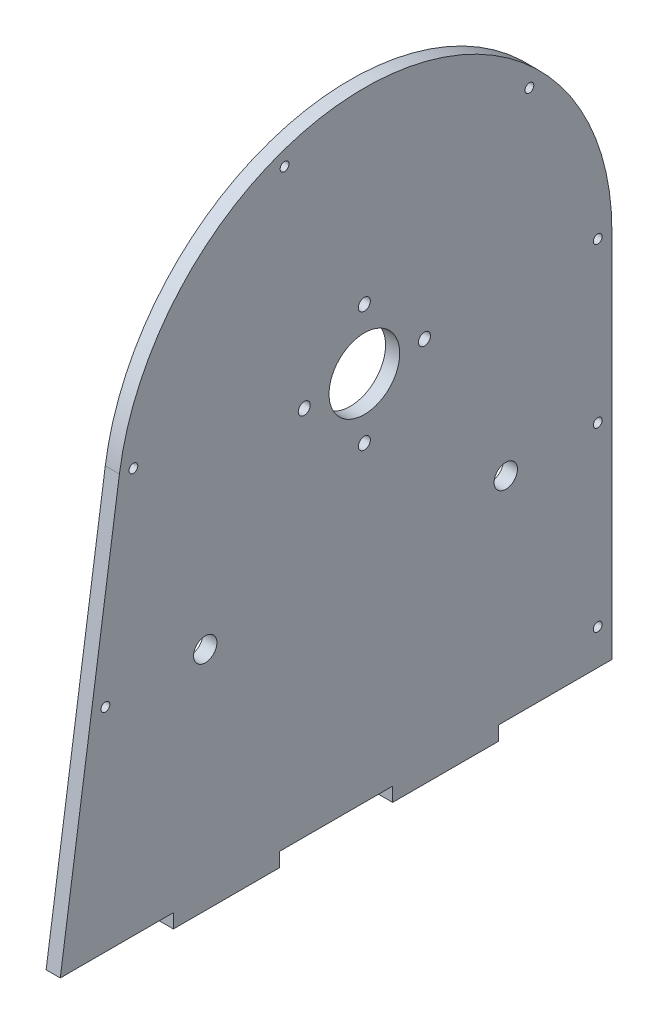
ISO-10303-21;
HEADER;
FILE_DESCRIPTION(('STEP AP214'),'2;1');
FILE_NAME('part.step','',(''),(''),'','','');
FILE_SCHEMA(('AUTOMOTIVE_DESIGN { 1 0 10303 214 1 1 1 1 }'));
ENDSEC;
DATA;
#1=APPLICATION_CONTEXT('core data for automotive mechanical design processes');
#2=APPLICATION_PROTOCOL_DEFINITION('international standard','automotive_design',2000,#1);
#3=PRODUCT_CONTEXT('',#1,'mechanical');
#4=PRODUCT('Part','Part','',(#3));
#5=PRODUCT_RELATED_PRODUCT_CATEGORY('part','',(#4));
#6=PRODUCT_DEFINITION_FORMATION('','',#4);
#7=PRODUCT_DEFINITION_CONTEXT('part definition',#1,'design');
#8=PRODUCT_DEFINITION('design','',#6,#7);
#9=PRODUCT_DEFINITION_SHAPE('','',#8);
#10=(LENGTH_UNIT() NAMED_UNIT(*) SI_UNIT(.MILLI.,.METRE.));
#11=(NAMED_UNIT(*) PLANE_ANGLE_UNIT() SI_UNIT($,.RADIAN.));
#12=(NAMED_UNIT(*) SI_UNIT($,.STERADIAN.) SOLID_ANGLE_UNIT());
#13=UNCERTAINTY_MEASURE_WITH_UNIT(LENGTH_MEASURE(1.E-05),#10,'distance_accuracy_value','');
#14=(GEOMETRIC_REPRESENTATION_CONTEXT(3) GLOBAL_UNCERTAINTY_ASSIGNED_CONTEXT((#13)) GLOBAL_UNIT_ASSIGNED_CONTEXT((#10,
#11,#12)) REPRESENTATION_CONTEXT('',''));
#15=CARTESIAN_POINT('',(0.,0.,0.));
#16=DIRECTION('',(0.,0.,1.));
#17=DIRECTION('',(1.,0.,0.));
#18=AXIS2_PLACEMENT_3D('',#15,#16,#17);
#19=CARTESIAN_POINT('',(4.,-186.520744782904,10.9034540857746));
#20=DIRECTION('',(0.,-1.,0.));
#21=DIRECTION('',(0.,0.,-1.));
#22=AXIS2_PLACEMENT_3D('',#19,#20,#21);
#23=PLANE('',#22);
#24=DIRECTION('',(-1.,0.,0.));
#25=VECTOR('',#24,1.);
#26=CARTESIAN_POINT('',(0.,-186.520744782904,134.903454085775));
#27=LINE('',#26,#25);
#28=CARTESIAN_POINT('',(4.,-186.520744782904,134.903454085775));
#29=VERTEX_POINT('',#28);
#30=CARTESIAN_POINT('',(0.,-186.520744782904,134.903454085775));
#31=VERTEX_POINT('',#30);
#32=EDGE_CURVE('E58',#29,#31,#27,.T.);
#33=ORIENTED_EDGE('',*,*,#32,.F.);
#34=DIRECTION('',(0.,0.,1.));
#35=VECTOR('',#34,1.);
#36=CARTESIAN_POINT('',(4.,-186.520744782904,1.90345408577496));
#37=LINE('',#36,#35);
#38=CARTESIAN_POINT('',(4.,-186.520744782904,166.903454085775));
#39=VERTEX_POINT('',#38);
#40=EDGE_CURVE('E267',#29,#39,#37,.T.);
#41=ORIENTED_EDGE('',*,*,#40,.T.);
#42=DIRECTION('',(-1.,0.,0.));
#43=VECTOR('',#42,1.);
#44=CARTESIAN_POINT('',(4.,-186.520744782904,166.903454085775));
#45=LINE('',#44,#43);
#46=CARTESIAN_POINT('',(0.,-186.520744782904,166.903454085775));
#47=VERTEX_POINT('',#46);
#48=EDGE_CURVE('E272',#39,#47,#45,.T.);
#49=ORIENTED_EDGE('',*,*,#48,.T.);
#50=DIRECTION('',(0.,0.,1.));
#51=VECTOR('',#50,1.);
#52=CARTESIAN_POINT('',(0.,-186.520744782904,10.9034540857746));
#53=LINE('',#52,#51);
#54=EDGE_CURVE('E262',#31,#47,#53,.T.);
#55=ORIENTED_EDGE('',*,*,#54,.F.);
#56=EDGE_LOOP('',(#33,#41,#49,#55));
#57=FACE_BOUND('',#56,.T.);
#58=ADVANCED_FACE('F41',(#57),#23,.T.);
#59=DIRECTION('',(1.,0.,0.));
#60=VECTOR('',#59,1.);
#61=CARTESIAN_POINT('',(0.,-186.520744782904,104.903454085775));
#62=LINE('',#61,#60);
#63=CARTESIAN_POINT('',(0.,-186.520744782904,104.903454085775));
#64=VERTEX_POINT('',#63);
#65=CARTESIAN_POINT('',(4.,-186.520744782904,104.903454085775));
#66=VERTEX_POINT('',#65);
#67=EDGE_CURVE('E183',#64,#66,#62,.T.);
#68=ORIENTED_EDGE('',*,*,#67,.F.);
#69=CARTESIAN_POINT('',(0.,-186.520744782904,72.9034540857746));
#70=VERTEX_POINT('',#69);
#71=EDGE_CURVE('E157',#70,#64,#53,.T.);
#72=ORIENTED_EDGE('',*,*,#71,.F.);
#73=DIRECTION('',(-1.,0.,0.));
#74=VECTOR('',#73,1.);
#75=CARTESIAN_POINT('',(0.,-186.520744782904,72.9034540857746));
#76=LINE('',#75,#74);
#77=CARTESIAN_POINT('',(4.,-186.520744782904,72.9034540857746));
#78=VERTEX_POINT('',#77);
#79=EDGE_CURVE('E66',#78,#70,#76,.T.);
#80=ORIENTED_EDGE('',*,*,#79,.F.);
#81=EDGE_CURVE('E266',#78,#66,#37,.T.);
#82=ORIENTED_EDGE('',*,*,#81,.T.);
#83=EDGE_LOOP('',(#68,#72,#80,#82));
#84=FACE_BOUND('',#83,.T.);
#85=ADVANCED_FACE('F343',(#84),#23,.T.);
#86=CARTESIAN_POINT('',(0.,-81.5207447795862,80.903454085775));
#87=DIRECTION('',(1.,0.,0.));
#88=DIRECTION('',(0.,0.,-1.));
#89=AXIS2_PLACEMENT_3D('',#86,#87,#88);
#90=PLANE('',#89);
#91=CARTESIAN_POINT('',(0.,-126.520744782904,40.9034540857746));
#92=DIRECTION('',(-1.,0.,0.));
#93=DIRECTION('',(0.,0.,1.));
#94=AXIS2_PLACEMENT_3D('',#91,#92,#93);
#95=CIRCLE('',#94,3.3);
#96=CARTESIAN_POINT('',(0.,-126.520744782904,44.2034540857746));
#97=VERTEX_POINT('',#96);
#98=EDGE_CURVE('E158',#97,#97,#95,.T.);
#99=ORIENTED_EDGE('',*,*,#98,.F.);
#100=EDGE_LOOP('',(#99));
#101=FACE_BOUND('',#100,.T.);
#102=CARTESIAN_POINT('',(0.,-126.520744782904,125.903454085775));
#103=DIRECTION('',(-1.,0.,0.));
#104=DIRECTION('',(0.,0.,1.));
#105=AXIS2_PLACEMENT_3D('',#102,#103,#104);
#106=CIRCLE('',#105,3.3);
#107=CARTESIAN_POINT('',(0.,-126.520744782904,129.203454085775));
#108=VERTEX_POINT('',#107);
#109=EDGE_CURVE('E191',#108,#108,#106,.T.);
#110=ORIENTED_EDGE('',*,*,#109,.F.);
#111=EDGE_LOOP('',(#110));
#112=FACE_BOUND('',#111,.T.);
#113=CARTESIAN_POINT('',(0.,-81.5207447795862,97.903454085775));
#114=DIRECTION('',(-1.,0.,0.));
#115=DIRECTION('',(0.,0.,1.));
#116=AXIS2_PLACEMENT_3D('',#113,#114,#115);
#117=CIRCLE('',#116,1.69999999999999);
#118=CARTESIAN_POINT('',(0.,-81.5207447795862,99.603454085775));
#119=VERTEX_POINT('',#118);
#120=EDGE_CURVE('E201',#119,#119,#117,.T.);
#121=ORIENTED_EDGE('',*,*,#120,.F.);
#122=EDGE_LOOP('',(#121));
#123=FACE_BOUND('',#122,.T.);
#124=CARTESIAN_POINT('',(0.,-64.5207447795862,80.903454085775));
#125=DIRECTION('',(-1.,0.,0.));
#126=DIRECTION('',(0.,0.,1.));
#127=AXIS2_PLACEMENT_3D('',#124,#125,#126);
#128=CIRCLE('',#127,1.69999999999999);
#129=CARTESIAN_POINT('',(0.,-64.5207447795862,82.603454085775));
#130=VERTEX_POINT('',#129);
#131=EDGE_CURVE('E207',#130,#130,#128,.T.);
#132=ORIENTED_EDGE('',*,*,#131,.F.);
#133=EDGE_LOOP('',(#132));
#134=FACE_BOUND('',#133,.T.);
#135=CARTESIAN_POINT('',(0.,-34.8516972212741,34.2344065274624));
#136=DIRECTION('',(1.,0.,0.));
#137=DIRECTION('',(0.,0.,-1.));
#138=AXIS2_PLACEMENT_3D('',#135,#136,#137);
#139=CIRCLE('',#138,1.24999999999999);
#140=CARTESIAN_POINT('',(0.,-34.8516972212741,32.9844065274624));
#141=VERTEX_POINT('',#140);
#142=EDGE_CURVE('E216',#141,#141,#139,.T.);
#143=ORIENTED_EDGE('',*,*,#142,.T.);
#144=EDGE_LOOP('',(#143));
#145=FACE_BOUND('',#144,.T.);
#146=CARTESIAN_POINT('',(0.,-19.5010318077161,103.476783545269));
#147=DIRECTION('',(1.,0.,0.));
#148=DIRECTION('',(0.,0.,-1.));
#149=AXIS2_PLACEMENT_3D('',#146,#147,#148);
#150=CIRCLE('',#149,1.24999999999999);
#151=CARTESIAN_POINT('',(0.,-19.5010318077161,102.226783545269));
#152=VERTEX_POINT('',#151);
#153=EDGE_CURVE('E220',#152,#152,#150,.T.);
#154=ORIENTED_EDGE('',*,*,#153,.T.);
#155=EDGE_LOOP('',(#154));
#156=FACE_BOUND('',#155,.T.);
#157=CARTESIAN_POINT('',(0.,-81.5207447795863,14.9034540857746));
#158=DIRECTION('',(1.,0.,0.));
#159=DIRECTION('',(0.,0.,-1.));
#160=AXIS2_PLACEMENT_3D('',#157,#158,#159);
#161=CIRCLE('',#160,1.24999999999999);
#162=CARTESIAN_POINT('',(0.,-81.5207447795863,13.6534540857746));
#163=VERTEX_POINT('',#162);
#164=EDGE_CURVE('E226',#163,#163,#161,.T.);
#165=ORIENTED_EDGE('',*,*,#164,.T.);
#166=EDGE_LOOP('',(#165));
#167=FACE_BOUND('',#166,.T.);
#168=CARTESIAN_POINT('',(0.,-72.0259104719607,146.21691457801));
#169=DIRECTION('',(1.,0.,0.));
#170=DIRECTION('',(0.,0.,-1.));
#171=AXIS2_PLACEMENT_3D('',#168,#169,#170);
#172=CIRCLE('',#171,1.24999999999999);
#173=CARTESIAN_POINT('',(0.,-72.0259104719607,144.96691457801));
#174=VERTEX_POINT('',#173);
#175=EDGE_CURVE('E230',#174,#174,#172,.T.);
#176=ORIENTED_EDGE('',*,*,#175,.T.);
#177=EDGE_LOOP('',(#176));
#178=FACE_BOUND('',#177,.T.);
#179=CARTESIAN_POINT('',(0.,-176.520744782904,14.9034540857746));
#180=DIRECTION('',(1.,0.,0.));
#181=DIRECTION('',(0.,0.,-1.));
#182=AXIS2_PLACEMENT_3D('',#179,#180,#181);
#183=CIRCLE('',#182,1.25);
#184=CARTESIAN_POINT('',(0.,-176.520744782904,13.6534540857746));
#185=VERTEX_POINT('',#184);
#186=EDGE_CURVE('E234',#185,#185,#183,.T.);
#187=ORIENTED_EDGE('',*,*,#186,.T.);
#188=EDGE_LOOP('',(#187));
#189=FACE_BOUND('',#188,.T.);
#190=CARTESIAN_POINT('',(0.,-126.520744782904,14.9034540857746));
#191=DIRECTION('',(1.,0.,0.));
#192=DIRECTION('',(0.,0.,-1.));
#193=AXIS2_PLACEMENT_3D('',#190,#191,#192);
#194=CIRCLE('',#193,1.25);
#195=CARTESIAN_POINT('',(0.,-126.520744782904,13.6534540857746));
#196=VERTEX_POINT('',#195);
#197=EDGE_CURVE('E238',#196,#196,#194,.T.);
#198=ORIENTED_EDGE('',*,*,#197,.T.);
#199=EDGE_LOOP('',(#198));
#200=FACE_BOUND('',#199,.T.);
#201=CARTESIAN_POINT('',(0.,-126.520744782904,154.139009327));
#202=DIRECTION('',(1.,0.,0.));
#203=DIRECTION('',(0.,0.,-1.));
#204=AXIS2_PLACEMENT_3D('',#201,#202,#203);
#205=CIRCLE('',#204,1.25);
#206=CARTESIAN_POINT('',(0.,-126.520744782904,152.889009327));
#207=VERTEX_POINT('',#206);
#208=EDGE_CURVE('E242',#207,#207,#205,.T.);
#209=ORIENTED_EDGE('',*,*,#208,.T.);
#210=EDGE_LOOP('',(#209));
#211=FACE_BOUND('',#210,.T.);
#212=CARTESIAN_POINT('',(0.,-81.5207447795863,63.903454085775));
#213=DIRECTION('',(-1.,0.,0.));
#214=DIRECTION('',(0.,0.,1.));
#215=AXIS2_PLACEMENT_3D('',#212,#213,#214);
#216=CIRCLE('',#215,1.69999999999999);
#217=CARTESIAN_POINT('',(0.,-81.5207447795863,65.6034540857749));
#218=VERTEX_POINT('',#217);
#219=EDGE_CURVE('E250',#218,#218,#216,.T.);
#220=ORIENTED_EDGE('',*,*,#219,.F.);
#221=EDGE_LOOP('',(#220));
#222=FACE_BOUND('',#221,.T.);
#223=CARTESIAN_POINT('',(0.,-81.5207447795862,80.903454085775));
#224=DIRECTION('',(1.,0.,0.));
#225=DIRECTION('',(0.,0.,-1.));
#226=AXIS2_PLACEMENT_3D('',#223,#224,#225);
#227=CIRCLE('',#226,9.99999999998197);
#228=CARTESIAN_POINT('',(0.,-81.5207447795862,70.903454085793));
#229=VERTEX_POINT('',#228);
#230=EDGE_CURVE('E256',#229,#229,#227,.T.);
#231=ORIENTED_EDGE('',*,*,#230,.T.);
#232=EDGE_LOOP('',(#231));
#233=FACE_BOUND('',#232,.T.);
#234=CARTESIAN_POINT('',(0.,-81.5207447795862,80.903454085775));
#235=DIRECTION('',(1.,0.,0.));
#236=DIRECTION('',(0.,0.,-1.));
#237=AXIS2_PLACEMENT_3D('',#234,#235,#236);
#238=CIRCLE('',#237,70.0000000000003);
#239=CARTESIAN_POINT('',(0.,-81.5207447795862,10.9034540857746));
#240=VERTEX_POINT('',#239);
#241=CARTESIAN_POINT('',(0.,-71.4504659684683,150.175306122994));
#242=VERTEX_POINT('',#241);
#243=EDGE_CURVE('E279',#240,#242,#238,.T.);
#244=ORIENTED_EDGE('',*,*,#243,.F.);
#245=DIRECTION('',(0.,1.,0.));
#246=VECTOR('',#245,1.);
#247=CARTESIAN_POINT('',(0.,-81.5207447795862,10.9034540857746));
#248=LINE('',#247,#246);
#249=CARTESIAN_POINT('',(0.,-186.520744782904,10.9034540857746));
#250=VERTEX_POINT('',#249);
#251=EDGE_CURVE('E11',#250,#240,#248,.T.);
#252=ORIENTED_EDGE('',*,*,#251,.F.);
#253=CARTESIAN_POINT('',(0.,-186.520744782904,42.9034540857746));
#254=VERTEX_POINT('',#253);
#255=EDGE_CURVE('E273',#250,#254,#53,.T.);
#256=ORIENTED_EDGE('',*,*,#255,.T.);
#257=DIRECTION('',(0.,1.,0.));
#258=VECTOR('',#257,1.);
#259=CARTESIAN_POINT('',(0.,-190.520744782904,42.9034540857746));
#260=LINE('',#259,#258);
#261=CARTESIAN_POINT('',(0.,-190.520744782904,42.9034540857746));
#262=VERTEX_POINT('',#261);
#263=EDGE_CURVE('E166',#262,#254,#260,.T.);
#264=ORIENTED_EDGE('',*,*,#263,.F.);
#265=DIRECTION('',(0.,0.,-1.));
#266=VECTOR('',#265,1.);
#267=CARTESIAN_POINT('',(0.,-190.520744782904,42.9034540857746));
#268=LINE('',#267,#266);
#269=CARTESIAN_POINT('',(0.,-190.520744782904,72.9034540857746));
#270=VERTEX_POINT('',#269);
#271=EDGE_CURVE('E180',#270,#262,#268,.T.);
#272=ORIENTED_EDGE('',*,*,#271,.F.);
#273=DIRECTION('',(0.,1.,0.));
#274=VECTOR('',#273,1.);
#275=CARTESIAN_POINT('',(0.,-190.520744782904,72.9034540857746));
#276=LINE('',#275,#274);
#277=EDGE_CURVE('E175',#270,#70,#276,.T.);
#278=ORIENTED_EDGE('',*,*,#277,.T.);
#279=ORIENTED_EDGE('',*,*,#71,.T.);
#280=DIRECTION('',(0.,1.,0.));
#281=VECTOR('',#280,1.);
#282=CARTESIAN_POINT('',(0.,-190.520744782904,104.903454085775));
#283=LINE('',#282,#281);
#284=CARTESIAN_POINT('',(0.,-190.520744782904,104.903454085775));
#285=VERTEX_POINT('',#284);
#286=EDGE_CURVE('E137',#285,#64,#283,.T.);
#287=ORIENTED_EDGE('',*,*,#286,.F.);
#288=DIRECTION('',(0.,0.,-1.));
#289=VECTOR('',#288,1.);
#290=CARTESIAN_POINT('',(0.,-190.520744782904,134.903454085775));
#291=LINE('',#290,#289);
#292=CARTESIAN_POINT('',(0.,-190.520744782904,134.903454085775));
#293=VERTEX_POINT('',#292);
#294=EDGE_CURVE('E143',#293,#285,#291,.T.);
#295=ORIENTED_EDGE('',*,*,#294,.F.);
#296=DIRECTION('',(0.,1.,0.));
#297=VECTOR('',#296,1.);
#298=CARTESIAN_POINT('',(0.,-190.520744782904,134.903454085775));
#299=LINE('',#298,#297);
#300=EDGE_CURVE('E629',#293,#31,#299,.T.);
#301=ORIENTED_EDGE('',*,*,#300,.T.);
#302=ORIENTED_EDGE('',*,*,#54,.T.);
#303=DIRECTION('',(0.,0.989597886245984,-0.143861125873113));
#304=VECTOR('',#303,1.);
#305=CARTESIAN_POINT('',(0.,-186.520744782904,166.903454085775));
#306=LINE('',#305,#304);
#307=EDGE_CURVE('E276',#47,#242,#306,.T.);
#308=ORIENTED_EDGE('',*,*,#307,.T.);
#309=EDGE_LOOP('',(#244,#252,#256,#264,#272,#278,#279,#287,#295,#301,#302,#308));
#310=FACE_BOUND('',#309,.T.);
#311=CARTESIAN_POINT('',(0.,-98.5207447795862,80.9034540857748));
#312=DIRECTION('',(-1.,0.,0.));
#313=DIRECTION('',(0.,0.,1.));
#314=AXIS2_PLACEMENT_3D('',#311,#312,#313);
#315=CIRCLE('',#314,1.69999999999999);
#316=CARTESIAN_POINT('',(0.,-98.5207447795862,82.6034540857748));
#317=VERTEX_POINT('',#316);
#318=EDGE_CURVE('E195',#317,#317,#315,.T.);
#319=ORIENTED_EDGE('',*,*,#318,.F.);
#320=EDGE_LOOP('',(#319));
#321=FACE_BOUND('',#320,.T.);
#322=ADVANCED_FACE('F154',(#101,#112,#123,#134,#145,#156,#167,#178,#189,#200,#211,#222,#233,
#310,#321),#90,.F.);
#323=DIRECTION('',(1.,0.,0.));
#324=VECTOR('',#323,1.);
#325=CARTESIAN_POINT('',(0.,-186.520744782904,42.9034540857746));
#326=LINE('',#325,#324);
#327=CARTESIAN_POINT('',(4.,-186.520744782904,42.9034540857746));
#328=VERTEX_POINT('',#327);
#329=EDGE_CURVE('E179',#254,#328,#326,.T.);
#330=ORIENTED_EDGE('',*,*,#329,.F.);
#331=ORIENTED_EDGE('',*,*,#255,.F.);
#332=DIRECTION('',(-1.,0.,0.));
#333=VECTOR('',#332,1.);
#334=CARTESIAN_POINT('',(4.,-186.520744782904,10.9034540857746));
#335=LINE('',#334,#333);
#336=CARTESIAN_POINT('',(4.,-186.520744782904,10.9034540857746));
#337=VERTEX_POINT('',#336);
#338=EDGE_CURVE('E245',#337,#250,#335,.T.);
#339=ORIENTED_EDGE('',*,*,#338,.F.);
#340=EDGE_CURVE('E263',#337,#328,#37,.T.);
#341=ORIENTED_EDGE('',*,*,#340,.T.);
#342=EDGE_LOOP('',(#330,#331,#339,#341));
#343=FACE_BOUND('',#342,.T.);
#344=ADVANCED_FACE('F43',(#343),#23,.T.);
#345=CARTESIAN_POINT('',(4.,-81.5207447795862,80.903454085775));
#346=DIRECTION('',(-1.,0.,0.));
#347=DIRECTION('',(0.,0.,1.));
#348=AXIS2_PLACEMENT_3D('',#345,#346,#347);
#349=CYLINDRICAL_SURFACE('',#348,70.0000000000003);
#350=ORIENTED_EDGE('',*,*,#243,.T.);
#351=DIRECTION('',(-1.,0.,0.));
#352=VECTOR('',#351,1.);
#353=CARTESIAN_POINT('',(4.,-71.4504659684683,150.175306122994));
#354=LINE('',#353,#352);
#355=CARTESIAN_POINT('',(4.,-71.4504659684683,150.175306122994));
#356=VERTEX_POINT('',#355);
#357=EDGE_CURVE('E50',#356,#242,#354,.T.);
#358=ORIENTED_EDGE('',*,*,#357,.F.);
#359=CARTESIAN_POINT('',(4.,-81.5207447795862,80.903454085775));
#360=DIRECTION('',(1.,0.,0.));
#361=DIRECTION('',(0.,0.,-1.));
#362=AXIS2_PLACEMENT_3D('',#359,#360,#361);
#363=CIRCLE('',#362,70.0000000000003);
#364=CARTESIAN_POINT('',(4.,-81.5207447795862,10.9034540857746));
#365=VERTEX_POINT('',#364);
#366=EDGE_CURVE('E270',#365,#356,#363,.T.);
#367=ORIENTED_EDGE('',*,*,#366,.F.);
#368=DIRECTION('',(-1.,0.,0.));
#369=VECTOR('',#368,1.);
#370=CARTESIAN_POINT('',(4.,-81.5207447795862,10.9034540857746));
#371=LINE('',#370,#369);
#372=EDGE_CURVE('E247',#365,#240,#371,.T.);
#373=ORIENTED_EDGE('',*,*,#372,.T.);
#374=EDGE_LOOP('',(#350,#358,#367,#373));
#375=FACE_BOUND('',#374,.T.);
#376=ADVANCED_FACE('F350',(#375),#349,.T.);
#377=CARTESIAN_POINT('',(4.,-186.520744782904,166.903454085775));
#378=DIRECTION('',(0.,0.143861125873113,0.989597886245984));
#379=DIRECTION('',(0.,-0.989597886245984,0.143861125873113));
#380=AXIS2_PLACEMENT_3D('',#377,#378,#379);
#381=PLANE('',#380);
#382=ORIENTED_EDGE('',*,*,#307,.F.);
#383=ORIENTED_EDGE('',*,*,#48,.F.);
#384=DIRECTION('',(0.,0.989597886245984,-0.143861125873113));
#385=VECTOR('',#384,1.);
#386=CARTESIAN_POINT('',(4.,-186.520744782904,166.903454085775));
#387=LINE('',#386,#385);
#388=EDGE_CURVE('E265',#39,#356,#387,.T.);
#389=ORIENTED_EDGE('',*,*,#388,.T.);
#390=ORIENTED_EDGE('',*,*,#357,.T.);
#391=EDGE_LOOP('',(#382,#383,#389,#390));
#392=FACE_BOUND('',#391,.T.);
#393=ADVANCED_FACE('F306',(#392),#381,.T.);
#394=CARTESIAN_POINT('',(4.,-81.5207447795862,80.903454085775));
#395=DIRECTION('',(1.,0.,0.));
#396=DIRECTION('',(0.,0.,-1.));
#397=AXIS2_PLACEMENT_3D('',#394,#395,#396);
#398=PLANE('',#397);
#399=CARTESIAN_POINT('',(4.,-126.520744782904,40.9034540857746));
#400=DIRECTION('',(1.,0.,0.));
#401=DIRECTION('',(0.,0.,-1.));
#402=AXIS2_PLACEMENT_3D('',#399,#400,#401);
#403=CIRCLE('',#402,3.3);
#404=CARTESIAN_POINT('',(4.,-126.520744782904,37.6034540857746));
#405=VERTEX_POINT('',#404);
#406=EDGE_CURVE('E45',#405,#405,#403,.T.);
#407=ORIENTED_EDGE('',*,*,#406,.F.);
#408=EDGE_LOOP('',(#407));
#409=FACE_BOUND('',#408,.T.);
#410=CARTESIAN_POINT('',(4.,-126.520744782904,125.903454085775));
#411=DIRECTION('',(1.,0.,0.));
#412=DIRECTION('',(0.,0.,-1.));
#413=AXIS2_PLACEMENT_3D('',#410,#411,#412);
#414=CIRCLE('',#413,3.3);
#415=CARTESIAN_POINT('',(4.,-126.520744782904,122.603454085775));
#416=VERTEX_POINT('',#415);
#417=EDGE_CURVE('E194',#416,#416,#414,.T.);
#418=ORIENTED_EDGE('',*,*,#417,.F.);
#419=EDGE_LOOP('',(#418));
#420=FACE_BOUND('',#419,.T.);
#421=CARTESIAN_POINT('',(4.,-98.5207447795862,80.9034540857748));
#422=DIRECTION('',(1.,0.,0.));
#423=DIRECTION('',(0.,0.,-1.));
#424=AXIS2_PLACEMENT_3D('',#421,#422,#423);
#425=CIRCLE('',#424,1.69999999999999);
#426=CARTESIAN_POINT('',(4.,-98.5207447795862,79.2034540857748));
#427=VERTEX_POINT('',#426);
#428=EDGE_CURVE('E198',#427,#427,#425,.T.);
#429=ORIENTED_EDGE('',*,*,#428,.F.);
#430=EDGE_LOOP('',(#429));
#431=FACE_BOUND('',#430,.T.);
#432=CARTESIAN_POINT('',(4.,-81.5207447795862,97.903454085775));
#433=DIRECTION('',(1.,0.,0.));
#434=DIRECTION('',(0.,0.,-1.));
#435=AXIS2_PLACEMENT_3D('',#432,#433,#434);
#436=CIRCLE('',#435,1.69999999999999);
#437=CARTESIAN_POINT('',(4.,-81.5207447795862,96.203454085775));
#438=VERTEX_POINT('',#437);
#439=EDGE_CURVE('E204',#438,#438,#436,.T.);
#440=ORIENTED_EDGE('',*,*,#439,.F.);
#441=EDGE_LOOP('',(#440));
#442=FACE_BOUND('',#441,.T.);
#443=CARTESIAN_POINT('',(4.,-64.5207447795862,80.903454085775));
#444=DIRECTION('',(1.,0.,0.));
#445=DIRECTION('',(0.,0.,-1.));
#446=AXIS2_PLACEMENT_3D('',#443,#444,#445);
#447=CIRCLE('',#446,1.69999999999999);
#448=CARTESIAN_POINT('',(4.,-64.5207447795862,79.203454085775));
#449=VERTEX_POINT('',#448);
#450=EDGE_CURVE('E210',#449,#449,#447,.T.);
#451=ORIENTED_EDGE('',*,*,#450,.F.);
#452=EDGE_LOOP('',(#451));
#453=FACE_BOUND('',#452,.T.);
#454=CARTESIAN_POINT('',(4.,-34.8516972212741,34.2344065274624));
#455=DIRECTION('',(1.,0.,0.));
#456=DIRECTION('',(0.,0.,-1.));
#457=AXIS2_PLACEMENT_3D('',#454,#455,#456);
#458=CIRCLE('',#457,1.24999999999999);
#459=CARTESIAN_POINT('',(4.,-34.8516972212741,32.9844065274624));
#460=VERTEX_POINT('',#459);
#461=EDGE_CURVE('E213',#460,#460,#458,.T.);
#462=ORIENTED_EDGE('',*,*,#461,.F.);
#463=EDGE_LOOP('',(#462));
#464=FACE_BOUND('',#463,.T.);
#465=CARTESIAN_POINT('',(4.,-19.5010318077161,103.476783545269));
#466=DIRECTION('',(1.,0.,0.));
#467=DIRECTION('',(0.,0.,-1.));
#468=AXIS2_PLACEMENT_3D('',#465,#466,#467);
#469=CIRCLE('',#468,1.24999999999999);
#470=CARTESIAN_POINT('',(4.,-19.5010318077161,102.226783545269));
#471=VERTEX_POINT('',#470);
#472=EDGE_CURVE('E217',#471,#471,#469,.T.);
#473=ORIENTED_EDGE('',*,*,#472,.F.);
#474=EDGE_LOOP('',(#473));
#475=FACE_BOUND('',#474,.T.);
#476=CARTESIAN_POINT('',(4.,-81.5207447795863,14.9034540857746));
#477=DIRECTION('',(1.,0.,0.));
#478=DIRECTION('',(0.,0.,-1.));
#479=AXIS2_PLACEMENT_3D('',#476,#477,#478);
#480=CIRCLE('',#479,1.24999999999999);
#481=CARTESIAN_POINT('',(4.,-81.5207447795863,13.6534540857746));
#482=VERTEX_POINT('',#481);
#483=EDGE_CURVE('E223',#482,#482,#480,.T.);
#484=ORIENTED_EDGE('',*,*,#483,.F.);
#485=EDGE_LOOP('',(#484));
#486=FACE_BOUND('',#485,.T.);
#487=CARTESIAN_POINT('',(4.,-72.0259104719607,146.21691457801));
#488=DIRECTION('',(1.,0.,0.));
#489=DIRECTION('',(0.,0.,-1.));
#490=AXIS2_PLACEMENT_3D('',#487,#488,#489);
#491=CIRCLE('',#490,1.24999999999999);
#492=CARTESIAN_POINT('',(4.,-72.0259104719607,144.96691457801));
#493=VERTEX_POINT('',#492);
#494=EDGE_CURVE('E227',#493,#493,#491,.T.);
#495=ORIENTED_EDGE('',*,*,#494,.F.);
#496=EDGE_LOOP('',(#495));
#497=FACE_BOUND('',#496,.T.);
#498=CARTESIAN_POINT('',(4.,-176.520744782904,14.9034540857746));
#499=DIRECTION('',(1.,0.,0.));
#500=DIRECTION('',(0.,0.,-1.));
#501=AXIS2_PLACEMENT_3D('',#498,#499,#500);
#502=CIRCLE('',#501,1.25);
#503=CARTESIAN_POINT('',(4.,-176.520744782904,13.6534540857746));
#504=VERTEX_POINT('',#503);
#505=EDGE_CURVE('E231',#504,#504,#502,.T.);
#506=ORIENTED_EDGE('',*,*,#505,.F.);
#507=EDGE_LOOP('',(#506));
#508=FACE_BOUND('',#507,.T.);
#509=CARTESIAN_POINT('',(4.,-126.520744782904,14.9034540857746));
#510=DIRECTION('',(1.,0.,0.));
#511=DIRECTION('',(0.,0.,-1.));
#512=AXIS2_PLACEMENT_3D('',#509,#510,#511);
#513=CIRCLE('',#512,1.25);
#514=CARTESIAN_POINT('',(4.,-126.520744782904,13.6534540857746));
#515=VERTEX_POINT('',#514);
#516=EDGE_CURVE('E235',#515,#515,#513,.T.);
#517=ORIENTED_EDGE('',*,*,#516,.F.);
#518=EDGE_LOOP('',(#517));
#519=FACE_BOUND('',#518,.T.);
#520=CARTESIAN_POINT('',(4.,-126.520744782904,154.139009327));
#521=DIRECTION('',(1.,0.,0.));
#522=DIRECTION('',(0.,0.,-1.));
#523=AXIS2_PLACEMENT_3D('',#520,#521,#522);
#524=CIRCLE('',#523,1.25);
#525=CARTESIAN_POINT('',(4.,-126.520744782904,152.889009327));
#526=VERTEX_POINT('',#525);
#527=EDGE_CURVE('E239',#526,#526,#524,.T.);
#528=ORIENTED_EDGE('',*,*,#527,.F.);
#529=EDGE_LOOP('',(#528));
#530=FACE_BOUND('',#529,.T.);
#531=DIRECTION('',(0.,-1.,0.));
#532=VECTOR('',#531,1.);
#533=CARTESIAN_POINT('',(4.,0.,10.9034540857746));
#534=LINE('',#533,#532);
#535=EDGE_CURVE('E243',#365,#337,#534,.T.);
#536=ORIENTED_EDGE('',*,*,#535,.F.);
#537=ORIENTED_EDGE('',*,*,#366,.T.);
#538=ORIENTED_EDGE('',*,*,#388,.F.);
#539=ORIENTED_EDGE('',*,*,#40,.F.);
#540=DIRECTION('',(0.,1.,0.));
#541=VECTOR('',#540,1.);
#542=CARTESIAN_POINT('',(4.,-190.520744782904,134.903454085775));
#543=LINE('',#542,#541);
#544=CARTESIAN_POINT('',(4.,-190.520744782904,134.903454085775));
#545=VERTEX_POINT('',#544);
#546=EDGE_CURVE('E162',#545,#29,#543,.T.);
#547=ORIENTED_EDGE('',*,*,#546,.F.);
#548=DIRECTION('',(0.,0.,1.));
#549=VECTOR('',#548,1.);
#550=CARTESIAN_POINT('',(4.,-190.520744782904,134.903454085775));
#551=LINE('',#550,#549);
#552=CARTESIAN_POINT('',(4.,-190.520744782904,104.903454085775));
#553=VERTEX_POINT('',#552);
#554=EDGE_CURVE('E142',#553,#545,#551,.T.);
#555=ORIENTED_EDGE('',*,*,#554,.F.);
#556=DIRECTION('',(0.,1.,0.));
#557=VECTOR('',#556,1.);
#558=CARTESIAN_POINT('',(4.,-190.520744782904,104.903454085775));
#559=LINE('',#558,#557);
#560=EDGE_CURVE('E139',#553,#66,#559,.T.);
#561=ORIENTED_EDGE('',*,*,#560,.T.);
#562=ORIENTED_EDGE('',*,*,#81,.F.);
#563=DIRECTION('',(0.,1.,0.));
#564=VECTOR('',#563,1.);
#565=CARTESIAN_POINT('',(4.,-190.520744782904,72.9034540857746));
#566=LINE('',#565,#564);
#567=CARTESIAN_POINT('',(4.,-190.520744782904,72.9034540857746));
#568=VERTEX_POINT('',#567);
#569=EDGE_CURVE('E172',#568,#78,#566,.T.);
#570=ORIENTED_EDGE('',*,*,#569,.F.);
#571=DIRECTION('',(0.,0.,1.));
#572=VECTOR('',#571,1.);
#573=CARTESIAN_POINT('',(4.,-190.520744782904,42.9034540857746));
#574=LINE('',#573,#572);
#575=CARTESIAN_POINT('',(4.,-190.520744782904,42.9034540857746));
#576=VERTEX_POINT('',#575);
#577=EDGE_CURVE('E185',#576,#568,#574,.T.);
#578=ORIENTED_EDGE('',*,*,#577,.F.);
#579=DIRECTION('',(0.,1.,0.));
#580=VECTOR('',#579,1.);
#581=CARTESIAN_POINT('',(4.,-190.520744782904,42.9034540857746));
#582=LINE('',#581,#580);
#583=EDGE_CURVE('E169',#576,#328,#582,.T.);
#584=ORIENTED_EDGE('',*,*,#583,.T.);
#585=ORIENTED_EDGE('',*,*,#340,.F.);
#586=EDGE_LOOP('',(#536,#537,#538,#539,#547,#555,#561,#562,#570,#578,#584,#585));
#587=FACE_BOUND('',#586,.T.);
#588=CARTESIAN_POINT('',(4.,-81.5207447795863,63.903454085775));
#589=DIRECTION('',(1.,0.,0.));
#590=DIRECTION('',(0.,0.,-1.));
#591=AXIS2_PLACEMENT_3D('',#588,#589,#590);
#592=CIRCLE('',#591,1.69999999999999);
#593=CARTESIAN_POINT('',(4.,-81.5207447795863,62.203454085775));
#594=VERTEX_POINT('',#593);
#595=EDGE_CURVE('E253',#594,#594,#592,.T.);
#596=ORIENTED_EDGE('',*,*,#595,.F.);
#597=EDGE_LOOP('',(#596));
#598=FACE_BOUND('',#597,.T.);
#599=CARTESIAN_POINT('',(4.,-81.5207447795862,80.903454085775));
#600=DIRECTION('',(1.,0.,0.));
#601=DIRECTION('',(0.,0.,-1.));
#602=AXIS2_PLACEMENT_3D('',#599,#600,#601);
#603=CIRCLE('',#602,9.99999999998197);
#604=CARTESIAN_POINT('',(4.,-81.5207447795862,70.903454085793));
#605=VERTEX_POINT('',#604);
#606=EDGE_CURVE('E259',#605,#605,#603,.F.);
#607=ORIENTED_EDGE('',*,*,#606,.T.);
#608=EDGE_LOOP('',(#607));
#609=FACE_BOUND('',#608,.T.);
#610=ADVANCED_FACE('F302',(#409,#420,#431,#442,#453,#464,#475,#486,#497,#508,#519,#530,#587,
#598,#609),#398,.T.);
#611=CARTESIAN_POINT('',(6.,-81.5207447795862,80.903454085775));
#612=DIRECTION('',(-1.,0.,0.));
#613=DIRECTION('',(0.,0.,1.));
#614=AXIS2_PLACEMENT_3D('',#611,#612,#613);
#615=CYLINDRICAL_SURFACE('',#614,9.99999999998197);
#616=ORIENTED_EDGE('',*,*,#606,.F.);
#617=EDGE_LOOP('',(#616));
#618=FACE_BOUND('',#617,.T.);
#619=ORIENTED_EDGE('',*,*,#230,.F.);
#620=EDGE_LOOP('',(#619));
#621=FACE_BOUND('',#620,.T.);
#622=ADVANCED_FACE('F305',(#618,#621),#615,.F.);
#623=CARTESIAN_POINT('',(0.,-81.5207447795863,63.903454085775));
#624=DIRECTION('',(-1.,0.,0.));
#625=DIRECTION('',(0.,0.,1.));
#626=AXIS2_PLACEMENT_3D('',#623,#624,#625);
#627=CYLINDRICAL_SURFACE('',#626,1.69999999999999);
#628=ORIENTED_EDGE('',*,*,#595,.T.);
#629=EDGE_LOOP('',(#628));
#630=FACE_BOUND('',#629,.T.);
#631=ORIENTED_EDGE('',*,*,#219,.T.);
#632=EDGE_LOOP('',(#631));
#633=FACE_BOUND('',#632,.T.);
#634=ADVANCED_FACE('F338',(#630,#633),#627,.F.);
#635=CARTESIAN_POINT('',(4.,0.,10.9034540857746));
#636=DIRECTION('',(0.,0.,-1.));
#637=DIRECTION('',(-1.,0.,0.));
#638=AXIS2_PLACEMENT_3D('',#635,#636,#637);
#639=PLANE('',#638);
#640=ORIENTED_EDGE('',*,*,#251,.T.);
#641=ORIENTED_EDGE('',*,*,#372,.F.);
#642=ORIENTED_EDGE('',*,*,#535,.T.);
#643=ORIENTED_EDGE('',*,*,#338,.T.);
#644=EDGE_LOOP('',(#640,#641,#642,#643));
#645=FACE_BOUND('',#644,.T.);
#646=ADVANCED_FACE('F500',(#645),#639,.T.);
#647=CARTESIAN_POINT('',(4.,-126.520744782904,154.139009327));
#648=DIRECTION('',(1.,0.,0.));
#649=DIRECTION('',(0.,0.,-1.));
#650=AXIS2_PLACEMENT_3D('',#647,#648,#649);
#651=CYLINDRICAL_SURFACE('',#650,1.25);
#652=ORIENTED_EDGE('',*,*,#527,.T.);
#653=EDGE_LOOP('',(#652));
#654=FACE_BOUND('',#653,.T.);
#655=ORIENTED_EDGE('',*,*,#208,.F.);
#656=EDGE_LOOP('',(#655));
#657=FACE_BOUND('',#656,.T.);
#658=ADVANCED_FACE('F496',(#654,#657),#651,.F.);
#659=CARTESIAN_POINT('',(4.,-126.520744782904,14.9034540857746));
#660=DIRECTION('',(1.,0.,0.));
#661=DIRECTION('',(0.,0.,-1.));
#662=AXIS2_PLACEMENT_3D('',#659,#660,#661);
#663=CYLINDRICAL_SURFACE('',#662,1.25);
#664=ORIENTED_EDGE('',*,*,#516,.T.);
#665=EDGE_LOOP('',(#664));
#666=FACE_BOUND('',#665,.T.);
#667=ORIENTED_EDGE('',*,*,#197,.F.);
#668=EDGE_LOOP('',(#667));
#669=FACE_BOUND('',#668,.T.);
#670=ADVANCED_FACE('F492',(#666,#669),#663,.F.);
#671=CARTESIAN_POINT('',(4.,-176.520744782904,14.9034540857746));
#672=DIRECTION('',(1.,0.,0.));
#673=DIRECTION('',(0.,0.,-1.));
#674=AXIS2_PLACEMENT_3D('',#671,#672,#673);
#675=CYLINDRICAL_SURFACE('',#674,1.25);
#676=ORIENTED_EDGE('',*,*,#505,.T.);
#677=EDGE_LOOP('',(#676));
#678=FACE_BOUND('',#677,.T.);
#679=ORIENTED_EDGE('',*,*,#186,.F.);
#680=EDGE_LOOP('',(#679));
#681=FACE_BOUND('',#680,.T.);
#682=ADVANCED_FACE('F488',(#678,#681),#675,.F.);
#683=CARTESIAN_POINT('',(4.,-72.0259104719607,146.21691457801));
#684=DIRECTION('',(1.,0.,0.));
#685=DIRECTION('',(0.,0.,-1.));
#686=AXIS2_PLACEMENT_3D('',#683,#684,#685);
#687=CYLINDRICAL_SURFACE('',#686,1.24999999999999);
#688=ORIENTED_EDGE('',*,*,#494,.T.);
#689=EDGE_LOOP('',(#688));
#690=FACE_BOUND('',#689,.T.);
#691=ORIENTED_EDGE('',*,*,#175,.F.);
#692=EDGE_LOOP('',(#691));
#693=FACE_BOUND('',#692,.T.);
#694=ADVANCED_FACE('F484',(#690,#693),#687,.F.);
#695=CARTESIAN_POINT('',(4.,-81.5207447795863,14.9034540857746));
#696=DIRECTION('',(1.,0.,0.));
#697=DIRECTION('',(0.,0.,-1.));
#698=AXIS2_PLACEMENT_3D('',#695,#696,#697);
#699=CYLINDRICAL_SURFACE('',#698,1.24999999999999);
#700=ORIENTED_EDGE('',*,*,#483,.T.);
#701=EDGE_LOOP('',(#700));
#702=FACE_BOUND('',#701,.T.);
#703=ORIENTED_EDGE('',*,*,#164,.F.);
#704=EDGE_LOOP('',(#703));
#705=FACE_BOUND('',#704,.T.);
#706=ADVANCED_FACE('F480',(#702,#705),#699,.F.);
#707=CARTESIAN_POINT('',(4.,-19.5010318077161,103.476783545269));
#708=DIRECTION('',(1.,0.,0.));
#709=DIRECTION('',(0.,0.,-1.));
#710=AXIS2_PLACEMENT_3D('',#707,#708,#709);
#711=CYLINDRICAL_SURFACE('',#710,1.24999999999999);
#712=ORIENTED_EDGE('',*,*,#472,.T.);
#713=EDGE_LOOP('',(#712));
#714=FACE_BOUND('',#713,.T.);
#715=ORIENTED_EDGE('',*,*,#153,.F.);
#716=EDGE_LOOP('',(#715));
#717=FACE_BOUND('',#716,.T.);
#718=ADVANCED_FACE('F476',(#714,#717),#711,.F.);
#719=CARTESIAN_POINT('',(4.,-34.8516972212741,34.2344065274624));
#720=DIRECTION('',(1.,0.,0.));
#721=DIRECTION('',(0.,0.,-1.));
#722=AXIS2_PLACEMENT_3D('',#719,#720,#721);
#723=CYLINDRICAL_SURFACE('',#722,1.24999999999999);
#724=ORIENTED_EDGE('',*,*,#461,.T.);
#725=EDGE_LOOP('',(#724));
#726=FACE_BOUND('',#725,.T.);
#727=ORIENTED_EDGE('',*,*,#142,.F.);
#728=EDGE_LOOP('',(#727));
#729=FACE_BOUND('',#728,.T.);
#730=ADVANCED_FACE('F472',(#726,#729),#723,.F.);
#731=CARTESIAN_POINT('',(0.,-64.5207447795862,80.903454085775));
#732=DIRECTION('',(-1.,0.,0.));
#733=DIRECTION('',(0.,0.,1.));
#734=AXIS2_PLACEMENT_3D('',#731,#732,#733);
#735=CYLINDRICAL_SURFACE('',#734,1.69999999999999);
#736=ORIENTED_EDGE('',*,*,#450,.T.);
#737=EDGE_LOOP('',(#736));
#738=FACE_BOUND('',#737,.T.);
#739=ORIENTED_EDGE('',*,*,#131,.T.);
#740=EDGE_LOOP('',(#739));
#741=FACE_BOUND('',#740,.T.);
#742=ADVANCED_FACE('F468',(#738,#741),#735,.F.);
#743=CARTESIAN_POINT('',(0.,-81.5207447795862,97.903454085775));
#744=DIRECTION('',(-1.,0.,0.));
#745=DIRECTION('',(0.,0.,1.));
#746=AXIS2_PLACEMENT_3D('',#743,#744,#745);
#747=CYLINDRICAL_SURFACE('',#746,1.69999999999999);
#748=ORIENTED_EDGE('',*,*,#439,.T.);
#749=EDGE_LOOP('',(#748));
#750=FACE_BOUND('',#749,.T.);
#751=ORIENTED_EDGE('',*,*,#120,.T.);
#752=EDGE_LOOP('',(#751));
#753=FACE_BOUND('',#752,.T.);
#754=ADVANCED_FACE('F464',(#750,#753),#747,.F.);
#755=CARTESIAN_POINT('',(0.,-98.5207447795862,80.9034540857748));
#756=DIRECTION('',(-1.,0.,0.));
#757=DIRECTION('',(0.,0.,1.));
#758=AXIS2_PLACEMENT_3D('',#755,#756,#757);
#759=CYLINDRICAL_SURFACE('',#758,1.69999999999999);
#760=ORIENTED_EDGE('',*,*,#428,.T.);
#761=EDGE_LOOP('',(#760));
#762=FACE_BOUND('',#761,.T.);
#763=ORIENTED_EDGE('',*,*,#318,.T.);
#764=EDGE_LOOP('',(#763));
#765=FACE_BOUND('',#764,.T.);
#766=ADVANCED_FACE('F461',(#762,#765),#759,.F.);
#767=CARTESIAN_POINT('',(0.,-126.520744782904,125.903454085775));
#768=DIRECTION('',(-1.,0.,0.));
#769=DIRECTION('',(0.,0.,1.));
#770=AXIS2_PLACEMENT_3D('',#767,#768,#769);
#771=CYLINDRICAL_SURFACE('',#770,3.3);
#772=ORIENTED_EDGE('',*,*,#417,.T.);
#773=EDGE_LOOP('',(#772));
#774=FACE_BOUND('',#773,.T.);
#775=ORIENTED_EDGE('',*,*,#109,.T.);
#776=EDGE_LOOP('',(#775));
#777=FACE_BOUND('',#776,.T.);
#778=ADVANCED_FACE('F299',(#774,#777),#771,.F.);
#779=CARTESIAN_POINT('',(0.,-126.520744782904,40.9034540857746));
#780=DIRECTION('',(-1.,0.,0.));
#781=DIRECTION('',(0.,0.,1.));
#782=AXIS2_PLACEMENT_3D('',#779,#780,#781);
#783=CYLINDRICAL_SURFACE('',#782,3.3);
#784=ORIENTED_EDGE('',*,*,#406,.T.);
#785=EDGE_LOOP('',(#784));
#786=FACE_BOUND('',#785,.T.);
#787=ORIENTED_EDGE('',*,*,#98,.T.);
#788=EDGE_LOOP('',(#787));
#789=FACE_BOUND('',#788,.T.);
#790=ADVANCED_FACE('F363',(#786,#789),#783,.F.);
#791=CARTESIAN_POINT('',(0.,-190.520744782904,42.9034540857746));
#792=DIRECTION('',(0.,0.,1.));
#793=DIRECTION('',(1.,0.,0.));
#794=AXIS2_PLACEMENT_3D('',#791,#792,#793);
#795=PLANE('',#794);
#796=ORIENTED_EDGE('',*,*,#329,.T.);
#797=ORIENTED_EDGE('',*,*,#583,.F.);
#798=DIRECTION('',(1.,0.,0.));
#799=VECTOR('',#798,1.);
#800=CARTESIAN_POINT('',(0.,-190.520744782904,42.9034540857746));
#801=LINE('',#800,#799);
#802=EDGE_CURVE('E187',#262,#576,#801,.T.);
#803=ORIENTED_EDGE('',*,*,#802,.F.);
#804=ORIENTED_EDGE('',*,*,#263,.T.);
#805=EDGE_LOOP('',(#796,#797,#803,#804));
#806=FACE_BOUND('',#805,.T.);
#807=ADVANCED_FACE('F404',(#806),#795,.F.);
#808=CARTESIAN_POINT('',(0.,-190.520744782904,72.9034540857746));
#809=DIRECTION('',(0.,0.,-1.));
#810=DIRECTION('',(-1.,0.,0.));
#811=AXIS2_PLACEMENT_3D('',#808,#809,#810);
#812=PLANE('',#811);
#813=ORIENTED_EDGE('',*,*,#79,.T.);
#814=ORIENTED_EDGE('',*,*,#277,.F.);
#815=DIRECTION('',(-1.,0.,0.));
#816=VECTOR('',#815,1.);
#817=CARTESIAN_POINT('',(0.,-190.520744782904,72.9034540857746));
#818=LINE('',#817,#816);
#819=EDGE_CURVE('E177',#568,#270,#818,.T.);
#820=ORIENTED_EDGE('',*,*,#819,.F.);
#821=ORIENTED_EDGE('',*,*,#569,.T.);
#822=EDGE_LOOP('',(#813,#814,#820,#821));
#823=FACE_BOUND('',#822,.T.);
#824=ADVANCED_FACE('F408',(#823),#812,.F.);
#825=CARTESIAN_POINT('',(0.,-190.520744782904,0.));
#826=DIRECTION('',(0.,1.,0.));
#827=DIRECTION('',(0.,0.,1.));
#828=AXIS2_PLACEMENT_3D('',#825,#826,#827);
#829=PLANE('',#828);
#830=ORIENTED_EDGE('',*,*,#271,.T.);
#831=ORIENTED_EDGE('',*,*,#802,.T.);
#832=ORIENTED_EDGE('',*,*,#577,.T.);
#833=ORIENTED_EDGE('',*,*,#819,.T.);
#834=EDGE_LOOP('',(#830,#831,#832,#833));
#835=FACE_BOUND('',#834,.T.);
#836=ADVANCED_FACE('F418',(#835),#829,.F.);
#837=CARTESIAN_POINT('',(0.,-190.520744782904,104.903454085775));
#838=DIRECTION('',(0.,0.,1.));
#839=DIRECTION('',(1.,0.,0.));
#840=AXIS2_PLACEMENT_3D('',#837,#838,#839);
#841=PLANE('',#840);
#842=ORIENTED_EDGE('',*,*,#67,.T.);
#843=ORIENTED_EDGE('',*,*,#560,.F.);
#844=DIRECTION('',(1.,0.,0.));
#845=VECTOR('',#844,1.);
#846=CARTESIAN_POINT('',(0.,-190.520744782904,104.903454085775));
#847=LINE('',#846,#845);
#848=EDGE_CURVE('E132',#285,#553,#847,.T.);
#849=ORIENTED_EDGE('',*,*,#848,.F.);
#850=ORIENTED_EDGE('',*,*,#286,.T.);
#851=EDGE_LOOP('',(#842,#843,#849,#850));
#852=FACE_BOUND('',#851,.T.);
#853=ADVANCED_FACE('F135',(#852),#841,.F.);
#854=CARTESIAN_POINT('',(0.,-190.520744782904,134.903454085775));
#855=DIRECTION('',(0.,0.,-1.));
#856=DIRECTION('',(-1.,0.,0.));
#857=AXIS2_PLACEMENT_3D('',#854,#855,#856);
#858=PLANE('',#857);
#859=ORIENTED_EDGE('',*,*,#32,.T.);
#860=ORIENTED_EDGE('',*,*,#300,.F.);
#861=DIRECTION('',(-1.,0.,0.));
#862=VECTOR('',#861,1.);
#863=CARTESIAN_POINT('',(0.,-190.520744782904,134.903454085775));
#864=LINE('',#863,#862);
#865=EDGE_CURVE('E148',#545,#293,#864,.T.);
#866=ORIENTED_EDGE('',*,*,#865,.F.);
#867=ORIENTED_EDGE('',*,*,#546,.T.);
#868=EDGE_LOOP('',(#859,#860,#866,#867));
#869=FACE_BOUND('',#868,.T.);
#870=ADVANCED_FACE('F437',(#869),#858,.F.);
#871=CARTESIAN_POINT('',(0.,-190.520744782904,0.));
#872=DIRECTION('',(0.,-1.,0.));
#873=DIRECTION('',(0.,0.,-1.));
#874=AXIS2_PLACEMENT_3D('',#871,#872,#873);
#875=PLANE('',#874);
#876=ORIENTED_EDGE('',*,*,#294,.T.);
#877=ORIENTED_EDGE('',*,*,#848,.T.);
#878=ORIENTED_EDGE('',*,*,#554,.T.);
#879=ORIENTED_EDGE('',*,*,#865,.T.);
#880=EDGE_LOOP('',(#876,#877,#878,#879));
#881=FACE_BOUND('',#880,.T.);
#882=ADVANCED_FACE('F146',(#881),#875,.T.);
#883=CLOSED_SHELL('',(#58,#85,#322,#344,#376,#393,#610,#622,#634,#646,#658,#670,#682,#694,#706,
#718,#730,#742,#754,#766,#778,#790,#807,#824,#836,#853,#870,#882));
#884=MANIFOLD_SOLID_BREP('B2',#883);
#885=ADVANCED_BREP_SHAPE_REPRESENTATION('',(#18,#884),#14);
#886=SHAPE_DEFINITION_REPRESENTATION(#9,#885);
ENDSEC;
END-ISO-10303-21;
